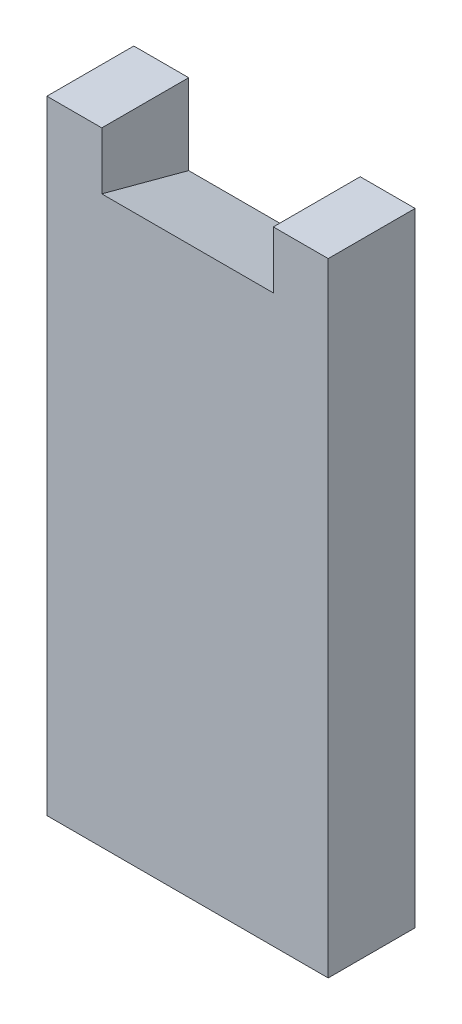
ISO-10303-21;
HEADER;
FILE_DESCRIPTION(('STEP AP214'),'2;1');
FILE_NAME('part.step','',(''),(''),'','','');
FILE_SCHEMA(('AUTOMOTIVE_DESIGN { 1 0 10303 214 1 1 1 1 }'));
ENDSEC;
DATA;
#1=APPLICATION_CONTEXT('core data for automotive mechanical design processes');
#2=APPLICATION_PROTOCOL_DEFINITION('international standard','automotive_design',2000,#1);
#3=PRODUCT_CONTEXT('',#1,'mechanical');
#4=PRODUCT('Part','Part','',(#3));
#5=PRODUCT_RELATED_PRODUCT_CATEGORY('part','',(#4));
#6=PRODUCT_DEFINITION_FORMATION('','',#4);
#7=PRODUCT_DEFINITION_CONTEXT('part definition',#1,'design');
#8=PRODUCT_DEFINITION('design','',#6,#7);
#9=PRODUCT_DEFINITION_SHAPE('','',#8);
#10=(LENGTH_UNIT() NAMED_UNIT(*) SI_UNIT(.MILLI.,.METRE.));
#11=(NAMED_UNIT(*) PLANE_ANGLE_UNIT() SI_UNIT($,.RADIAN.));
#12=(NAMED_UNIT(*) SI_UNIT($,.STERADIAN.) SOLID_ANGLE_UNIT());
#13=UNCERTAINTY_MEASURE_WITH_UNIT(LENGTH_MEASURE(1.E-05),#10,'distance_accuracy_value','');
#14=(GEOMETRIC_REPRESENTATION_CONTEXT(3) GLOBAL_UNCERTAINTY_ASSIGNED_CONTEXT((#13)) GLOBAL_UNIT_ASSIGNED_CONTEXT((#10,
#11,#12)) REPRESENTATION_CONTEXT('',''));
#15=CARTESIAN_POINT('',(0.,0.,0.));
#16=DIRECTION('',(0.,0.,1.));
#17=DIRECTION('',(1.,0.,0.));
#18=AXIS2_PLACEMENT_3D('',#15,#16,#17);
#19=CARTESIAN_POINT('',(0.,0.,7.6));
#20=DIRECTION('',(0.,1.,0.));
#21=DIRECTION('',(-1.,0.,0.));
#22=AXIS2_PLACEMENT_3D('',#19,#20,#21);
#23=PLANE('',#22);
#24=DIRECTION('',(1.,0.,0.));
#25=VECTOR('',#24,1.);
#26=CARTESIAN_POINT('',(0.,0.,0.));
#27=LINE('',#26,#25);
#28=CARTESIAN_POINT('',(19.8,0.,0.));
#29=VERTEX_POINT('',#28);
#30=CARTESIAN_POINT('',(24.6,0.,0.));
#31=VERTEX_POINT('',#30);
#32=EDGE_CURVE('E117',#29,#31,#27,.T.);
#33=ORIENTED_EDGE('',*,*,#32,.F.);
#34=DIRECTION('',(0.,0.,-1.));
#35=VECTOR('',#34,1.);
#36=CARTESIAN_POINT('',(19.8,0.,7.6));
#37=LINE('',#36,#35);
#38=CARTESIAN_POINT('',(19.8,0.,7.6));
#39=VERTEX_POINT('',#38);
#40=EDGE_CURVE('E11',#39,#29,#37,.T.);
#41=ORIENTED_EDGE('',*,*,#40,.F.);
#42=DIRECTION('',(1.,0.,0.));
#43=VECTOR('',#42,1.);
#44=CARTESIAN_POINT('',(0.,0.,7.6));
#45=LINE('',#44,#43);
#46=CARTESIAN_POINT('',(24.6,0.,7.6));
#47=VERTEX_POINT('',#46);
#48=EDGE_CURVE('E127',#39,#47,#45,.T.);
#49=ORIENTED_EDGE('',*,*,#48,.T.);
#50=DIRECTION('',(0.,0.,-1.));
#51=VECTOR('',#50,1.);
#52=CARTESIAN_POINT('',(24.6,0.,7.6));
#53=LINE('',#52,#51);
#54=EDGE_CURVE('E58',#47,#31,#53,.T.);
#55=ORIENTED_EDGE('',*,*,#54,.T.);
#56=EDGE_LOOP('',(#33,#41,#49,#55));
#57=FACE_BOUND('',#56,.T.);
#58=ADVANCED_FACE('F39',(#57),#23,.T.);
#59=CARTESIAN_POINT('',(19.8,0.,7.6));
#60=DIRECTION('',(1.,0.,0.));
#61=DIRECTION('',(0.,0.,-1.));
#62=AXIS2_PLACEMENT_3D('',#59,#60,#61);
#63=PLANE('',#62);
#64=DIRECTION('',(0.,-1.,0.));
#65=VECTOR('',#64,1.);
#66=CARTESIAN_POINT('',(19.8,0.,0.));
#67=LINE('',#66,#65);
#68=CARTESIAN_POINT('',(19.8,-7.03641386247654,0.));
#69=VERTEX_POINT('',#68);
#70=EDGE_CURVE('E107',#29,#69,#67,.T.);
#71=ORIENTED_EDGE('',*,*,#70,.T.);
#72=DIRECTION('',(0.,-0.258819045102521,-0.965925826289068));
#73=VECTOR('',#72,1.);
#74=CARTESIAN_POINT('',(19.8,-5.,7.6));
#75=LINE('',#74,#73);
#76=CARTESIAN_POINT('',(19.8,-5.,7.6));
#77=VERTEX_POINT('',#76);
#78=EDGE_CURVE('E49',#77,#69,#75,.T.);
#79=ORIENTED_EDGE('',*,*,#78,.F.);
#80=DIRECTION('',(0.,-1.,0.));
#81=VECTOR('',#80,1.);
#82=CARTESIAN_POINT('',(19.8,0.,7.6));
#83=LINE('',#82,#81);
#84=EDGE_CURVE('E155',#39,#77,#83,.T.);
#85=ORIENTED_EDGE('',*,*,#84,.F.);
#86=ORIENTED_EDGE('',*,*,#40,.T.);
#87=EDGE_LOOP('',(#71,#79,#85,#86));
#88=FACE_BOUND('',#87,.T.);
#89=ADVANCED_FACE('F164',(#88),#63,.F.);
#90=CARTESIAN_POINT('',(0.,-5.,7.6));
#91=DIRECTION('',(0.,0.965925826289068,-0.258819045102521));
#92=DIRECTION('',(0.,0.258819045102521,0.965925826289068));
#93=AXIS2_PLACEMENT_3D('',#90,#91,#92);
#94=PLANE('',#93);
#95=DIRECTION('',(1.,0.,0.));
#96=VECTOR('',#95,1.);
#97=CARTESIAN_POINT('',(0.,-7.03641386247654,0.));
#98=LINE('',#97,#96);
#99=CARTESIAN_POINT('',(4.8,-7.03641386247654,0.));
#100=VERTEX_POINT('',#99);
#101=EDGE_CURVE('E104',#100,#69,#98,.T.);
#102=ORIENTED_EDGE('',*,*,#101,.F.);
#103=DIRECTION('',(0.,-0.258819045102521,-0.965925826289068));
#104=VECTOR('',#103,1.);
#105=CARTESIAN_POINT('',(4.8,-5.,7.6));
#106=LINE('',#105,#104);
#107=CARTESIAN_POINT('',(4.8,-5.,7.6));
#108=VERTEX_POINT('',#107);
#109=EDGE_CURVE('E43',#108,#100,#106,.T.);
#110=ORIENTED_EDGE('',*,*,#109,.F.);
#111=DIRECTION('',(1.,0.,0.));
#112=VECTOR('',#111,1.);
#113=CARTESIAN_POINT('',(0.,-5.,7.6));
#114=LINE('',#113,#112);
#115=EDGE_CURVE('E151',#108,#77,#114,.T.);
#116=ORIENTED_EDGE('',*,*,#115,.T.);
#117=ORIENTED_EDGE('',*,*,#78,.T.);
#118=EDGE_LOOP('',(#102,#110,#116,#117));
#119=FACE_BOUND('',#118,.T.);
#120=ADVANCED_FACE('F41',(#119),#94,.T.);
#121=CARTESIAN_POINT('',(4.8,0.,7.6));
#122=DIRECTION('',(1.,0.,0.));
#123=DIRECTION('',(0.,1.,0.));
#124=AXIS2_PLACEMENT_3D('',#121,#122,#123);
#125=PLANE('',#124);
#126=DIRECTION('',(0.,-1.,0.));
#127=VECTOR('',#126,1.);
#128=CARTESIAN_POINT('',(4.8,0.,0.));
#129=LINE('',#128,#127);
#130=CARTESIAN_POINT('',(4.8,0.,0.));
#131=VERTEX_POINT('',#130);
#132=EDGE_CURVE('E96',#131,#100,#129,.T.);
#133=ORIENTED_EDGE('',*,*,#132,.F.);
#134=DIRECTION('',(0.,0.,-1.));
#135=VECTOR('',#134,1.);
#136=CARTESIAN_POINT('',(4.8,0.,7.6));
#137=LINE('',#136,#135);
#138=CARTESIAN_POINT('',(4.8,0.,7.6));
#139=VERTEX_POINT('',#138);
#140=EDGE_CURVE('E102',#139,#131,#137,.T.);
#141=ORIENTED_EDGE('',*,*,#140,.F.);
#142=DIRECTION('',(0.,-1.,0.));
#143=VECTOR('',#142,1.);
#144=CARTESIAN_POINT('',(4.8,0.,7.6));
#145=LINE('',#144,#143);
#146=EDGE_CURVE('E100',#139,#108,#145,.T.);
#147=ORIENTED_EDGE('',*,*,#146,.T.);
#148=ORIENTED_EDGE('',*,*,#109,.T.);
#149=EDGE_LOOP('',(#133,#141,#147,#148));
#150=FACE_BOUND('',#149,.T.);
#151=ADVANCED_FACE('F93',(#150),#125,.T.);
#152=CARTESIAN_POINT('',(0.,0.,0.));
#153=VERTEX_POINT('',#152);
#154=EDGE_CURVE('E113',#153,#131,#27,.T.);
#155=ORIENTED_EDGE('',*,*,#154,.F.);
#156=DIRECTION('',(0.,0.,-1.));
#157=VECTOR('',#156,1.);
#158=CARTESIAN_POINT('',(0.,0.,7.6));
#159=LINE('',#158,#157);
#160=CARTESIAN_POINT('',(0.,0.,7.6));
#161=VERTEX_POINT('',#160);
#162=EDGE_CURVE('E135',#161,#153,#159,.T.);
#163=ORIENTED_EDGE('',*,*,#162,.F.);
#164=EDGE_CURVE('E143',#161,#139,#45,.T.);
#165=ORIENTED_EDGE('',*,*,#164,.T.);
#166=ORIENTED_EDGE('',*,*,#140,.T.);
#167=EDGE_LOOP('',(#155,#163,#165,#166));
#168=FACE_BOUND('',#167,.T.);
#169=ADVANCED_FACE('F139',(#168),#23,.T.);
#170=CARTESIAN_POINT('',(0.,0.,7.6));
#171=DIRECTION('',(1.,0.,0.));
#172=DIRECTION('',(0.,1.,0.));
#173=AXIS2_PLACEMENT_3D('',#170,#171,#172);
#174=PLANE('',#173);
#175=DIRECTION('',(0.,-1.,0.));
#176=VECTOR('',#175,1.);
#177=CARTESIAN_POINT('',(0.,0.,0.));
#178=LINE('',#177,#176);
#179=CARTESIAN_POINT('',(0.,-54.485,0.));
#180=VERTEX_POINT('',#179);
#181=EDGE_CURVE('E115',#153,#180,#178,.T.);
#182=ORIENTED_EDGE('',*,*,#181,.T.);
#183=DIRECTION('',(0.,0.,-1.));
#184=VECTOR('',#183,1.);
#185=CARTESIAN_POINT('',(0.,-54.485,7.6));
#186=LINE('',#185,#184);
#187=CARTESIAN_POINT('',(0.,-54.485,7.6));
#188=VERTEX_POINT('',#187);
#189=EDGE_CURVE('E132',#188,#180,#186,.T.);
#190=ORIENTED_EDGE('',*,*,#189,.F.);
#191=DIRECTION('',(0.,-1.,0.));
#192=VECTOR('',#191,1.);
#193=CARTESIAN_POINT('',(0.,0.,7.6));
#194=LINE('',#193,#192);
#195=EDGE_CURVE('E153',#161,#188,#194,.T.);
#196=ORIENTED_EDGE('',*,*,#195,.F.);
#197=ORIENTED_EDGE('',*,*,#162,.T.);
#198=EDGE_LOOP('',(#182,#190,#196,#197));
#199=FACE_BOUND('',#198,.T.);
#200=ADVANCED_FACE('F178',(#199),#174,.F.);
#201=CARTESIAN_POINT('',(0.,-54.485,7.6));
#202=DIRECTION('',(0.,1.,0.));
#203=DIRECTION('',(0.,0.,1.));
#204=AXIS2_PLACEMENT_3D('',#201,#202,#203);
#205=PLANE('',#204);
#206=DIRECTION('',(1.,0.,0.));
#207=VECTOR('',#206,1.);
#208=CARTESIAN_POINT('',(0.,-54.485,0.));
#209=LINE('',#208,#207);
#210=CARTESIAN_POINT('',(24.6,-54.485,0.));
#211=VERTEX_POINT('',#210);
#212=EDGE_CURVE('E121',#180,#211,#209,.T.);
#213=ORIENTED_EDGE('',*,*,#212,.T.);
#214=DIRECTION('',(0.,0.,-1.));
#215=VECTOR('',#214,1.);
#216=CARTESIAN_POINT('',(24.6,-54.485,7.6));
#217=LINE('',#216,#215);
#218=CARTESIAN_POINT('',(24.6,-54.485,7.6));
#219=VERTEX_POINT('',#218);
#220=EDGE_CURVE('E129',#219,#211,#217,.T.);
#221=ORIENTED_EDGE('',*,*,#220,.F.);
#222=DIRECTION('',(1.,0.,0.));
#223=VECTOR('',#222,1.);
#224=CARTESIAN_POINT('',(0.,-54.485,7.6));
#225=LINE('',#224,#223);
#226=EDGE_CURVE('E160',#188,#219,#225,.T.);
#227=ORIENTED_EDGE('',*,*,#226,.F.);
#228=ORIENTED_EDGE('',*,*,#189,.T.);
#229=EDGE_LOOP('',(#213,#221,#227,#228));
#230=FACE_BOUND('',#229,.T.);
#231=ADVANCED_FACE('F175',(#230),#205,.F.);
#232=CARTESIAN_POINT('',(24.6,0.,7.6));
#233=DIRECTION('',(1.,0.,0.));
#234=DIRECTION('',(0.,1.,0.));
#235=AXIS2_PLACEMENT_3D('',#232,#233,#234);
#236=PLANE('',#235);
#237=DIRECTION('',(0.,-1.,0.));
#238=VECTOR('',#237,1.);
#239=CARTESIAN_POINT('',(24.6,0.,0.));
#240=LINE('',#239,#238);
#241=EDGE_CURVE('E124',#31,#211,#240,.T.);
#242=ORIENTED_EDGE('',*,*,#241,.F.);
#243=ORIENTED_EDGE('',*,*,#54,.F.);
#244=DIRECTION('',(0.,-1.,0.));
#245=VECTOR('',#244,1.);
#246=CARTESIAN_POINT('',(24.6,0.,7.6));
#247=LINE('',#246,#245);
#248=EDGE_CURVE('E130',#47,#219,#247,.T.);
#249=ORIENTED_EDGE('',*,*,#248,.T.);
#250=ORIENTED_EDGE('',*,*,#220,.T.);
#251=EDGE_LOOP('',(#242,#243,#249,#250));
#252=FACE_BOUND('',#251,.T.);
#253=ADVANCED_FACE('F172',(#252),#236,.T.);
#254=CARTESIAN_POINT('',(0.,0.,7.6));
#255=DIRECTION('',(0.,0.,1.));
#256=DIRECTION('',(1.,0.,0.));
#257=AXIS2_PLACEMENT_3D('',#254,#255,#256);
#258=PLANE('',#257);
#259=ORIENTED_EDGE('',*,*,#48,.F.);
#260=ORIENTED_EDGE('',*,*,#84,.T.);
#261=ORIENTED_EDGE('',*,*,#115,.F.);
#262=ORIENTED_EDGE('',*,*,#146,.F.);
#263=ORIENTED_EDGE('',*,*,#164,.F.);
#264=ORIENTED_EDGE('',*,*,#195,.T.);
#265=ORIENTED_EDGE('',*,*,#226,.T.);
#266=ORIENTED_EDGE('',*,*,#248,.F.);
#267=EDGE_LOOP('',(#259,#260,#261,#262,#263,#264,#265,#266));
#268=FACE_BOUND('',#267,.T.);
#269=ADVANCED_FACE('F148',(#268),#258,.T.);
#270=CARTESIAN_POINT('',(0.,0.,0.));
#271=DIRECTION('',(0.,0.,1.));
#272=DIRECTION('',(1.,0.,0.));
#273=AXIS2_PLACEMENT_3D('',#270,#271,#272);
#274=PLANE('',#273);
#275=ORIENTED_EDGE('',*,*,#32,.T.);
#276=ORIENTED_EDGE('',*,*,#241,.T.);
#277=ORIENTED_EDGE('',*,*,#212,.F.);
#278=ORIENTED_EDGE('',*,*,#181,.F.);
#279=ORIENTED_EDGE('',*,*,#154,.T.);
#280=ORIENTED_EDGE('',*,*,#132,.T.);
#281=ORIENTED_EDGE('',*,*,#101,.T.);
#282=ORIENTED_EDGE('',*,*,#70,.F.);
#283=EDGE_LOOP('',(#275,#276,#277,#278,#279,#280,#281,#282));
#284=FACE_BOUND('',#283,.T.);
#285=ADVANCED_FACE('F110',(#284),#274,.F.);
#286=CLOSED_SHELL('',(#58,#89,#120,#151,#169,#200,#231,#253,#269,#285));
#287=MANIFOLD_SOLID_BREP('B2',#286);
#288=ADVANCED_BREP_SHAPE_REPRESENTATION('',(#18,#287),#14);
#289=SHAPE_DEFINITION_REPRESENTATION(#9,#288);
ENDSEC;
END-ISO-10303-21;
